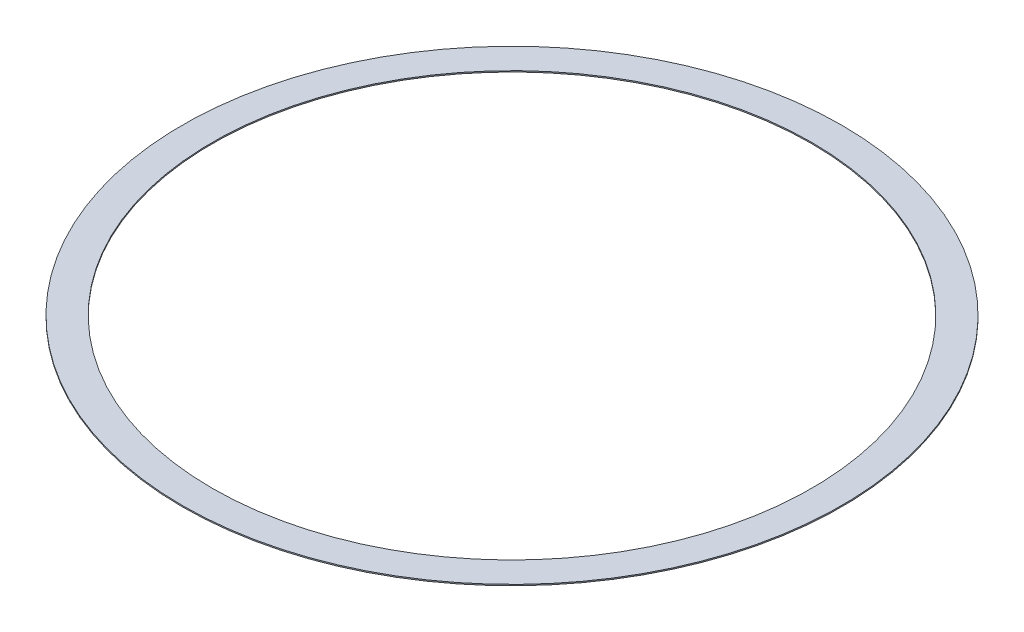
ISO-10303-21;
HEADER;
FILE_DESCRIPTION(('STEP AP214'),'2;1');
FILE_NAME('part.step','',(''),(''),'','','');
FILE_SCHEMA(('AUTOMOTIVE_DESIGN { 1 0 10303 214 1 1 1 1 }'));
ENDSEC;
DATA;
#1=APPLICATION_CONTEXT('core data for automotive mechanical design processes');
#2=APPLICATION_PROTOCOL_DEFINITION('international standard','automotive_design',2000,#1);
#3=PRODUCT_CONTEXT('',#1,'mechanical');
#4=PRODUCT('Part','Part','',(#3));
#5=PRODUCT_RELATED_PRODUCT_CATEGORY('part','',(#4));
#6=PRODUCT_DEFINITION_FORMATION('','',#4);
#7=PRODUCT_DEFINITION_CONTEXT('part definition',#1,'design');
#8=PRODUCT_DEFINITION('design','',#6,#7);
#9=PRODUCT_DEFINITION_SHAPE('','',#8);
#10=(LENGTH_UNIT() NAMED_UNIT(*) SI_UNIT(.MILLI.,.METRE.));
#11=(NAMED_UNIT(*) PLANE_ANGLE_UNIT() SI_UNIT($,.RADIAN.));
#12=(NAMED_UNIT(*) SI_UNIT($,.STERADIAN.) SOLID_ANGLE_UNIT());
#13=UNCERTAINTY_MEASURE_WITH_UNIT(LENGTH_MEASURE(1.E-05),#10,'distance_accuracy_value','');
#14=(GEOMETRIC_REPRESENTATION_CONTEXT(3) GLOBAL_UNCERTAINTY_ASSIGNED_CONTEXT((#13)) GLOBAL_UNIT_ASSIGNED_CONTEXT((#10,
#11,#12)) REPRESENTATION_CONTEXT('',''));
#15=CARTESIAN_POINT('',(0.,0.,0.));
#16=DIRECTION('',(0.,0.,1.));
#17=DIRECTION('',(1.,0.,0.));
#18=AXIS2_PLACEMENT_3D('',#15,#16,#17);
#19=CARTESIAN_POINT('',(0.,2.,0.));
#20=DIRECTION('',(0.,1.,0.));
#21=DIRECTION('',(0.,0.,1.));
#22=AXIS2_PLACEMENT_3D('',#19,#20,#21);
#23=PLANE('',#22);
#24=CARTESIAN_POINT('',(0.,2.,0.));
#25=DIRECTION('',(0.,1.,0.));
#26=DIRECTION('',(0.,0.,1.));
#27=AXIS2_PLACEMENT_3D('',#24,#25,#26);
#28=CIRCLE('',#27,551.5);
#29=CARTESIAN_POINT('',(0.,2.,551.5));
#30=VERTEX_POINT('',#29);
#31=EDGE_CURVE('E10',#30,#30,#28,.T.);
#32=ORIENTED_EDGE('',*,*,#31,.T.);
#33=EDGE_LOOP('',(#32));
#34=FACE_BOUND('',#33,.T.);
#35=CARTESIAN_POINT('',(0.,2.,0.));
#36=DIRECTION('',(0.,1.,0.));
#37=DIRECTION('',(0.,0.,1.));
#38=AXIS2_PLACEMENT_3D('',#35,#36,#37);
#39=CIRCLE('',#38,501.5);
#40=CARTESIAN_POINT('',(0.,2.,501.5));
#41=VERTEX_POINT('',#40);
#42=EDGE_CURVE('E42',#41,#41,#39,.T.);
#43=ORIENTED_EDGE('',*,*,#42,.F.);
#44=EDGE_LOOP('',(#43));
#45=FACE_BOUND('',#44,.T.);
#46=ADVANCED_FACE('F31',(#34,#45),#23,.T.);
#47=CARTESIAN_POINT('',(0.,0.,0.));
#48=DIRECTION('',(0.,1.,0.));
#49=DIRECTION('',(0.,0.,1.));
#50=AXIS2_PLACEMENT_3D('',#47,#48,#49);
#51=PLANE('',#50);
#52=CARTESIAN_POINT('',(0.,0.,0.));
#53=DIRECTION('',(0.,1.,0.));
#54=DIRECTION('',(0.,0.,1.));
#55=AXIS2_PLACEMENT_3D('',#52,#53,#54);
#56=CIRCLE('',#55,551.5);
#57=CARTESIAN_POINT('',(0.,0.,551.5));
#58=VERTEX_POINT('',#57);
#59=EDGE_CURVE('E35',#58,#58,#56,.T.);
#60=ORIENTED_EDGE('',*,*,#59,.F.);
#61=EDGE_LOOP('',(#60));
#62=FACE_BOUND('',#61,.T.);
#63=CARTESIAN_POINT('',(0.,0.,0.));
#64=DIRECTION('',(0.,1.,0.));
#65=DIRECTION('',(0.,0.,1.));
#66=AXIS2_PLACEMENT_3D('',#63,#64,#65);
#67=CIRCLE('',#66,501.5);
#68=CARTESIAN_POINT('',(0.,0.,501.5));
#69=VERTEX_POINT('',#68);
#70=EDGE_CURVE('E44',#69,#69,#67,.T.);
#71=ORIENTED_EDGE('',*,*,#70,.T.);
#72=EDGE_LOOP('',(#71));
#73=FACE_BOUND('',#72,.T.);
#74=ADVANCED_FACE('F54',(#62,#73),#51,.F.);
#75=CARTESIAN_POINT('',(0.,2.,0.));
#76=DIRECTION('',(0.,-1.,0.));
#77=DIRECTION('',(0.,0.,-1.));
#78=AXIS2_PLACEMENT_3D('',#75,#76,#77);
#79=CYLINDRICAL_SURFACE('',#78,551.5);
#80=ORIENTED_EDGE('',*,*,#31,.F.);
#81=EDGE_LOOP('',(#80));
#82=FACE_BOUND('',#81,.T.);
#83=ORIENTED_EDGE('',*,*,#59,.T.);
#84=EDGE_LOOP('',(#83));
#85=FACE_BOUND('',#84,.T.);
#86=ADVANCED_FACE('F33',(#82,#85),#79,.T.);
#87=CARTESIAN_POINT('',(0.,2.,0.));
#88=DIRECTION('',(0.,-1.,0.));
#89=DIRECTION('',(0.,0.,-1.));
#90=AXIS2_PLACEMENT_3D('',#87,#88,#89);
#91=CYLINDRICAL_SURFACE('',#90,501.5);
#92=ORIENTED_EDGE('',*,*,#42,.T.);
#93=EDGE_LOOP('',(#92));
#94=FACE_BOUND('',#93,.T.);
#95=ORIENTED_EDGE('',*,*,#70,.F.);
#96=EDGE_LOOP('',(#95));
#97=FACE_BOUND('',#96,.T.);
#98=ADVANCED_FACE('F50',(#94,#97),#91,.F.);
#99=CLOSED_SHELL('',(#46,#74,#86,#98));
#100=MANIFOLD_SOLID_BREP('B2',#99);
#101=ADVANCED_BREP_SHAPE_REPRESENTATION('',(#18,#100),#14);
#102=SHAPE_DEFINITION_REPRESENTATION(#9,#101);
ENDSEC;
END-ISO-10303-21;
